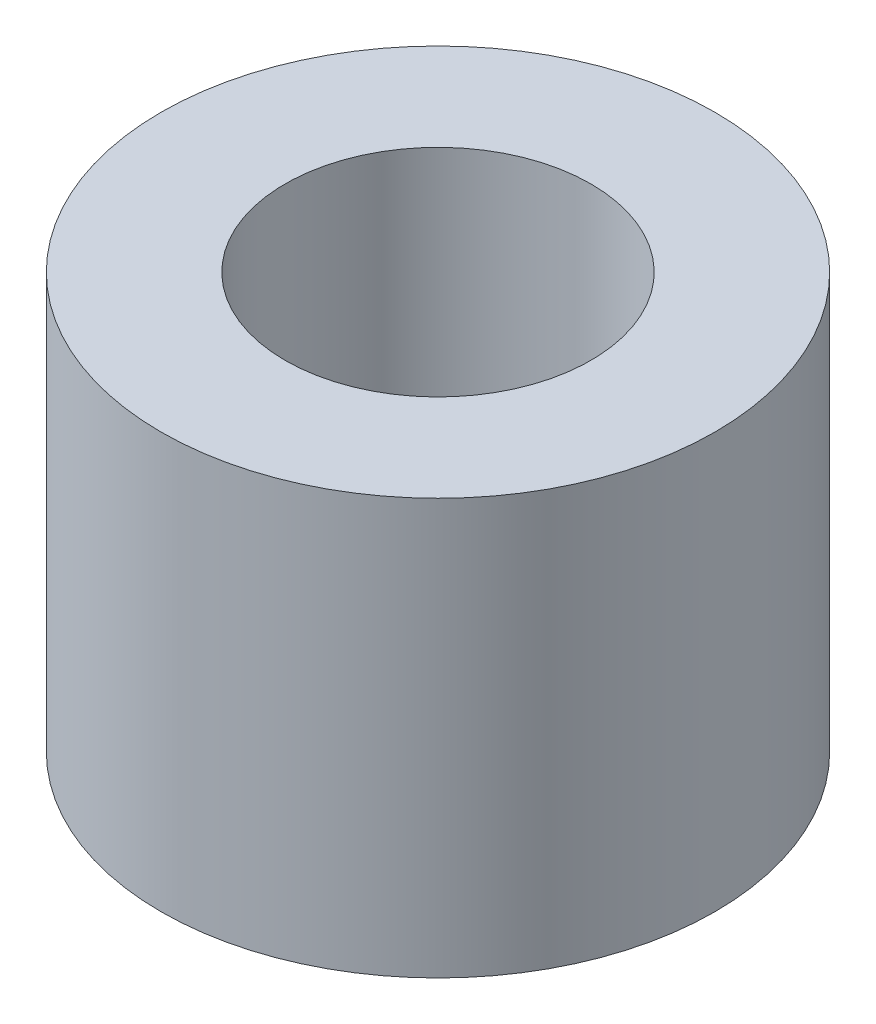
ISO-10303-21;
HEADER;
FILE_DESCRIPTION(('STEP AP214'),'2;1');
FILE_NAME('part.step','',(''),(''),'','','');
FILE_SCHEMA(('AUTOMOTIVE_DESIGN { 1 0 10303 214 1 1 1 1 }'));
ENDSEC;
DATA;
#1=APPLICATION_CONTEXT('core data for automotive mechanical design processes');
#2=APPLICATION_PROTOCOL_DEFINITION('international standard','automotive_design',2000,#1);
#3=PRODUCT_CONTEXT('',#1,'mechanical');
#4=PRODUCT('Part','Part','',(#3));
#5=PRODUCT_RELATED_PRODUCT_CATEGORY('part','',(#4));
#6=PRODUCT_DEFINITION_FORMATION('','',#4);
#7=PRODUCT_DEFINITION_CONTEXT('part definition',#1,'design');
#8=PRODUCT_DEFINITION('design','',#6,#7);
#9=PRODUCT_DEFINITION_SHAPE('','',#8);
#10=(LENGTH_UNIT() NAMED_UNIT(*) SI_UNIT(.MILLI.,.METRE.));
#11=(NAMED_UNIT(*) PLANE_ANGLE_UNIT() SI_UNIT($,.RADIAN.));
#12=(NAMED_UNIT(*) SI_UNIT($,.STERADIAN.) SOLID_ANGLE_UNIT());
#13=UNCERTAINTY_MEASURE_WITH_UNIT(LENGTH_MEASURE(1.E-05),#10,'distance_accuracy_value','');
#14=(GEOMETRIC_REPRESENTATION_CONTEXT(3) GLOBAL_UNCERTAINTY_ASSIGNED_CONTEXT((#13)) GLOBAL_UNIT_ASSIGNED_CONTEXT((#10,
#11,#12)) REPRESENTATION_CONTEXT('',''));
#15=CARTESIAN_POINT('',(0.,0.,0.));
#16=DIRECTION('',(0.,0.,1.));
#17=DIRECTION('',(1.,0.,0.));
#18=AXIS2_PLACEMENT_3D('',#15,#16,#17);
#19=CARTESIAN_POINT('',(0.,4.7625,0.));
#20=DIRECTION('',(0.,1.,0.));
#21=DIRECTION('',(0.,0.,1.));
#22=AXIS2_PLACEMENT_3D('',#19,#20,#21);
#23=PLANE('',#22);
#24=CARTESIAN_POINT('',(0.,4.7625,0.));
#25=DIRECTION('',(0.,1.,0.));
#26=DIRECTION('',(0.,0.,1.));
#27=AXIS2_PLACEMENT_3D('',#24,#25,#26);
#28=CIRCLE('',#27,3.175);
#29=CARTESIAN_POINT('',(0.,4.7625,-3.175));
#30=VERTEX_POINT('',#29);
#31=EDGE_CURVE('E10',#30,#30,#28,.T.);
#32=ORIENTED_EDGE('',*,*,#31,.T.);
#33=EDGE_LOOP('',(#32));
#34=FACE_BOUND('',#33,.T.);
#35=CARTESIAN_POINT('',(0.,4.7625,0.));
#36=DIRECTION('',(0.,1.,0.));
#37=DIRECTION('',(0.,0.,1.));
#38=AXIS2_PLACEMENT_3D('',#35,#36,#37);
#39=CIRCLE('',#38,1.7526);
#40=CARTESIAN_POINT('',(0.,4.7625,-1.7526));
#41=VERTEX_POINT('',#40);
#42=EDGE_CURVE('E39',#41,#41,#39,.T.);
#43=ORIENTED_EDGE('',*,*,#42,.F.);
#44=EDGE_LOOP('',(#43));
#45=FACE_BOUND('',#44,.T.);
#46=ADVANCED_FACE('F28',(#34,#45),#23,.T.);
#47=CARTESIAN_POINT('',(0.,0.,0.));
#48=DIRECTION('',(0.,1.,0.));
#49=DIRECTION('',(0.,0.,1.));
#50=AXIS2_PLACEMENT_3D('',#47,#48,#49);
#51=PLANE('',#50);
#52=CARTESIAN_POINT('',(0.,0.,0.));
#53=DIRECTION('',(0.,1.,0.));
#54=DIRECTION('',(0.,0.,1.));
#55=AXIS2_PLACEMENT_3D('',#52,#53,#54);
#56=CIRCLE('',#55,3.175);
#57=CARTESIAN_POINT('',(0.,0.,-3.175));
#58=VERTEX_POINT('',#57);
#59=EDGE_CURVE('E32',#58,#58,#56,.T.);
#60=ORIENTED_EDGE('',*,*,#59,.F.);
#61=EDGE_LOOP('',(#60));
#62=FACE_BOUND('',#61,.T.);
#63=CARTESIAN_POINT('',(0.,0.,0.));
#64=DIRECTION('',(0.,1.,0.));
#65=DIRECTION('',(0.,0.,1.));
#66=AXIS2_PLACEMENT_3D('',#63,#64,#65);
#67=CIRCLE('',#66,1.7526);
#68=CARTESIAN_POINT('',(0.,0.,-1.7526));
#69=VERTEX_POINT('',#68);
#70=EDGE_CURVE('E41',#69,#69,#67,.T.);
#71=ORIENTED_EDGE('',*,*,#70,.T.);
#72=EDGE_LOOP('',(#71));
#73=FACE_BOUND('',#72,.T.);
#74=ADVANCED_FACE('F51',(#62,#73),#51,.F.);
#75=CARTESIAN_POINT('',(0.,4.7625,0.));
#76=DIRECTION('',(0.,-1.,0.));
#77=DIRECTION('',(0.,0.,-1.));
#78=AXIS2_PLACEMENT_3D('',#75,#76,#77);
#79=CYLINDRICAL_SURFACE('',#78,3.175);
#80=CARTESIAN_POINT('',(0.,4.7625,-3.175));
#81=CARTESIAN_POINT('',(0.,4.712890625,-3.175));
#82=CARTESIAN_POINT('',(0.,4.66328125,-3.175));
#83=CARTESIAN_POINT('',(0.,4.5640625,-3.175));
#84=CARTESIAN_POINT('',(0.,4.514453125,-3.175));
#85=CARTESIAN_POINT('',(0.,4.415234375,-3.175));
#86=CARTESIAN_POINT('',(0.,4.365625,-3.175));
#87=CARTESIAN_POINT('',(0.,4.26640625,-3.175));
#88=CARTESIAN_POINT('',(0.,4.216796875,-3.175));
#89=CARTESIAN_POINT('',(0.,4.117578125,-3.175));
#90=CARTESIAN_POINT('',(0.,4.06796875,-3.175));
#91=CARTESIAN_POINT('',(0.,3.96875,-3.175));
#92=CARTESIAN_POINT('',(0.,3.919140625,-3.175));
#93=CARTESIAN_POINT('',(0.,3.819921875,-3.175));
#94=CARTESIAN_POINT('',(0.,3.7703125,-3.175));
#95=CARTESIAN_POINT('',(0.,3.67109375,-3.175));
#96=CARTESIAN_POINT('',(0.,3.621484375,-3.175));
#97=CARTESIAN_POINT('',(0.,3.522265625,-3.175));
#98=CARTESIAN_POINT('',(0.,3.47265625,-3.175));
#99=CARTESIAN_POINT('',(0.,3.3734375,-3.175));
#100=CARTESIAN_POINT('',(0.,3.323828125,-3.175));
#101=CARTESIAN_POINT('',(0.,3.224609375,-3.175));
#102=CARTESIAN_POINT('',(0.,3.175,-3.175));
#103=CARTESIAN_POINT('',(0.,3.07578125,-3.175));
#104=CARTESIAN_POINT('',(0.,3.026171875,-3.175));
#105=CARTESIAN_POINT('',(0.,2.926953125,-3.175));
#106=CARTESIAN_POINT('',(0.,2.87734375,-3.175));
#107=CARTESIAN_POINT('',(0.,2.778125,-3.175));
#108=CARTESIAN_POINT('',(0.,2.728515625,-3.175));
#109=CARTESIAN_POINT('',(0.,2.629296875,-3.175));
#110=CARTESIAN_POINT('',(0.,2.5796875,-3.175));
#111=CARTESIAN_POINT('',(0.,2.48046875,-3.175));
#112=CARTESIAN_POINT('',(0.,2.430859375,-3.175));
#113=CARTESIAN_POINT('',(0.,2.331640625,-3.175));
#114=CARTESIAN_POINT('',(0.,2.28203125,-3.175));
#115=CARTESIAN_POINT('',(0.,2.1828125,-3.175));
#116=CARTESIAN_POINT('',(0.,2.133203125,-3.175));
#117=CARTESIAN_POINT('',(0.,2.033984375,-3.175));
#118=CARTESIAN_POINT('',(0.,1.984375,-3.175));
#119=CARTESIAN_POINT('',(0.,1.88515625,-3.175));
#120=CARTESIAN_POINT('',(0.,1.835546875,-3.175));
#121=CARTESIAN_POINT('',(0.,1.736328125,-3.175));
#122=CARTESIAN_POINT('',(0.,1.68671875,-3.175));
#123=CARTESIAN_POINT('',(0.,1.5875,-3.175));
#124=CARTESIAN_POINT('',(0.,1.537890625,-3.175));
#125=CARTESIAN_POINT('',(0.,1.438671875,-3.175));
#126=CARTESIAN_POINT('',(0.,1.3890625,-3.175));
#127=CARTESIAN_POINT('',(0.,1.28984375,-3.175));
#128=CARTESIAN_POINT('',(0.,1.240234375,-3.175));
#129=CARTESIAN_POINT('',(0.,1.141015625,-3.175));
#130=CARTESIAN_POINT('',(0.,1.09140625,-3.175));
#131=CARTESIAN_POINT('',(0.,0.9921875,-3.175));
#132=CARTESIAN_POINT('',(0.,0.942578125,-3.175));
#133=CARTESIAN_POINT('',(0.,0.843359375,-3.175));
#134=CARTESIAN_POINT('',(0.,0.79375,-3.175));
#135=CARTESIAN_POINT('',(0.,0.69453125,-3.175));
#136=CARTESIAN_POINT('',(0.,0.644921875,-3.175));
#137=CARTESIAN_POINT('',(0.,0.545703125,-3.175));
#138=CARTESIAN_POINT('',(0.,0.49609375,-3.175));
#139=CARTESIAN_POINT('',(0.,0.396875,-3.175));
#140=CARTESIAN_POINT('',(0.,0.347265625,-3.175));
#141=CARTESIAN_POINT('',(0.,0.248046875,-3.175));
#142=CARTESIAN_POINT('',(0.,0.1984375,-3.175));
#143=CARTESIAN_POINT('',(0.,0.09921875,-3.175));
#144=CARTESIAN_POINT('',(0.,0.049609375,-3.175));
#145=CARTESIAN_POINT('',(0.,0.,-3.175));
#146=B_SPLINE_CURVE_WITH_KNOTS('',3,(#80,#81,#82,#83,#84,#85,#86,#87,#88,#89,#90,#91,#92,#93,
#94,#95,#96,#97,#98,#99,#100,#101,#102,#103,#104,#105,#106,#107,#108,#109,#110,#111,#112,#113,
#114,#115,#116,#117,#118,#119,#120,#121,#122,#123,#124,#125,#126,#127,#128,#129,#130,#131,#132,
#133,#134,#135,#136,#137,#138,#139,#140,#141,#142,#143,#144,#145),.UNSPECIFIED.,.F.,.F.,(4,2,2,
2,2,2,2,2,2,2,2,2,2,2,2,2,2,2,2,2,2,2,2,2,2,2,2,2,2,2,2,2,4),(0.,0.148828124999999,
0.297656249999999,0.446484374999999,0.595312499999999,0.744140625,0.89296875,1.041796875,
1.190625,1.339453125,1.48828125,1.637109375,1.7859375,1.934765625,2.08359375,2.232421875,
2.38125,2.530078125,2.67890625,2.827734375,2.9765625,3.125390625,3.27421875,3.423046875,
3.571875,3.720703125,3.86953125,4.018359375,4.1671875,4.316015625,4.46484375,4.613671875,
4.7625),.UNSPECIFIED.);
#147=EDGE_CURVE('BSEAM30',#30,#58,#146,.T.);
#148=ORIENTED_EDGE('',*,*,#31,.F.);
#149=ORIENTED_EDGE('',*,*,#59,.T.);
#150=ORIENTED_EDGE('',*,*,#147,.T.);
#151=ORIENTED_EDGE('',*,*,#147,.F.);
#152=EDGE_LOOP('',(#148,#150,#149,#151));
#153=FACE_BOUND('',#152,.T.);
#154=ADVANCED_FACE('F30',(#153),#79,.T.);
#155=CARTESIAN_POINT('',(0.,4.7625,0.));
#156=DIRECTION('',(0.,-1.,0.));
#157=DIRECTION('',(0.,0.,-1.));
#158=AXIS2_PLACEMENT_3D('',#155,#156,#157);
#159=CYLINDRICAL_SURFACE('',#158,1.7526);
#160=CARTESIAN_POINT('',(0.,4.7625,-1.7526));
#161=CARTESIAN_POINT('',(0.,4.712890625,-1.7526));
#162=CARTESIAN_POINT('',(0.,4.66328125,-1.7526));
#163=CARTESIAN_POINT('',(0.,4.5640625,-1.7526));
#164=CARTESIAN_POINT('',(0.,4.514453125,-1.7526));
#165=CARTESIAN_POINT('',(0.,4.415234375,-1.7526));
#166=CARTESIAN_POINT('',(0.,4.365625,-1.7526));
#167=CARTESIAN_POINT('',(0.,4.26640625,-1.7526));
#168=CARTESIAN_POINT('',(0.,4.216796875,-1.7526));
#169=CARTESIAN_POINT('',(0.,4.117578125,-1.7526));
#170=CARTESIAN_POINT('',(0.,4.06796875,-1.7526));
#171=CARTESIAN_POINT('',(0.,3.96875,-1.7526));
#172=CARTESIAN_POINT('',(0.,3.919140625,-1.7526));
#173=CARTESIAN_POINT('',(0.,3.819921875,-1.7526));
#174=CARTESIAN_POINT('',(0.,3.7703125,-1.7526));
#175=CARTESIAN_POINT('',(0.,3.67109375,-1.7526));
#176=CARTESIAN_POINT('',(0.,3.621484375,-1.7526));
#177=CARTESIAN_POINT('',(0.,3.522265625,-1.7526));
#178=CARTESIAN_POINT('',(0.,3.47265625,-1.7526));
#179=CARTESIAN_POINT('',(0.,3.3734375,-1.7526));
#180=CARTESIAN_POINT('',(0.,3.323828125,-1.7526));
#181=CARTESIAN_POINT('',(0.,3.224609375,-1.7526));
#182=CARTESIAN_POINT('',(0.,3.175,-1.7526));
#183=CARTESIAN_POINT('',(0.,3.07578125,-1.7526));
#184=CARTESIAN_POINT('',(0.,3.026171875,-1.7526));
#185=CARTESIAN_POINT('',(0.,2.926953125,-1.7526));
#186=CARTESIAN_POINT('',(0.,2.87734375,-1.7526));
#187=CARTESIAN_POINT('',(0.,2.778125,-1.7526));
#188=CARTESIAN_POINT('',(0.,2.728515625,-1.7526));
#189=CARTESIAN_POINT('',(0.,2.629296875,-1.7526));
#190=CARTESIAN_POINT('',(0.,2.5796875,-1.7526));
#191=CARTESIAN_POINT('',(0.,2.48046875,-1.7526));
#192=CARTESIAN_POINT('',(0.,2.430859375,-1.7526));
#193=CARTESIAN_POINT('',(0.,2.331640625,-1.7526));
#194=CARTESIAN_POINT('',(0.,2.28203125,-1.7526));
#195=CARTESIAN_POINT('',(0.,2.1828125,-1.7526));
#196=CARTESIAN_POINT('',(0.,2.133203125,-1.7526));
#197=CARTESIAN_POINT('',(0.,2.033984375,-1.7526));
#198=CARTESIAN_POINT('',(0.,1.984375,-1.7526));
#199=CARTESIAN_POINT('',(0.,1.88515625,-1.7526));
#200=CARTESIAN_POINT('',(0.,1.835546875,-1.7526));
#201=CARTESIAN_POINT('',(0.,1.736328125,-1.7526));
#202=CARTESIAN_POINT('',(0.,1.68671875,-1.7526));
#203=CARTESIAN_POINT('',(0.,1.5875,-1.7526));
#204=CARTESIAN_POINT('',(0.,1.537890625,-1.7526));
#205=CARTESIAN_POINT('',(0.,1.438671875,-1.7526));
#206=CARTESIAN_POINT('',(0.,1.3890625,-1.7526));
#207=CARTESIAN_POINT('',(0.,1.28984375,-1.7526));
#208=CARTESIAN_POINT('',(0.,1.240234375,-1.7526));
#209=CARTESIAN_POINT('',(0.,1.141015625,-1.7526));
#210=CARTESIAN_POINT('',(0.,1.09140625,-1.7526));
#211=CARTESIAN_POINT('',(0.,0.9921875,-1.7526));
#212=CARTESIAN_POINT('',(0.,0.942578125,-1.7526));
#213=CARTESIAN_POINT('',(0.,0.843359375,-1.7526));
#214=CARTESIAN_POINT('',(0.,0.79375,-1.7526));
#215=CARTESIAN_POINT('',(0.,0.69453125,-1.7526));
#216=CARTESIAN_POINT('',(0.,0.644921875,-1.7526));
#217=CARTESIAN_POINT('',(0.,0.545703125,-1.7526));
#218=CARTESIAN_POINT('',(0.,0.49609375,-1.7526));
#219=CARTESIAN_POINT('',(0.,0.396875,-1.7526));
#220=CARTESIAN_POINT('',(0.,0.347265625,-1.7526));
#221=CARTESIAN_POINT('',(0.,0.248046875,-1.7526));
#222=CARTESIAN_POINT('',(0.,0.1984375,-1.7526));
#223=CARTESIAN_POINT('',(0.,0.09921875,-1.7526));
#224=CARTESIAN_POINT('',(0.,0.049609375,-1.7526));
#225=CARTESIAN_POINT('',(0.,0.,-1.7526));
#226=B_SPLINE_CURVE_WITH_KNOTS('',3,(#160,#161,#162,#163,#164,#165,#166,#167,#168,#169,#170,
#171,#172,#173,#174,#175,#176,#177,#178,#179,#180,#181,#182,#183,#184,#185,#186,#187,#188,#189,
#190,#191,#192,#193,#194,#195,#196,#197,#198,#199,#200,#201,#202,#203,#204,#205,#206,#207,#208,
#209,#210,#211,#212,#213,#214,#215,#216,#217,#218,#219,#220,#221,#222,#223,#224,#225),
.UNSPECIFIED.,.F.,.F.,(4,2,2,2,2,2,2,2,2,2,2,2,2,2,2,2,2,2,2,2,2,2,2,2,2,2,2,2,2,2,2,2,4),(0.,
0.148828124999999,0.297656249999999,0.446484374999999,0.595312499999999,0.744140625,0.89296875,
1.041796875,1.190625,1.339453125,1.48828125,1.637109375,1.7859375,1.934765625,2.08359375,
2.232421875,2.38125,2.530078125,2.67890625,2.827734375,2.9765625,3.125390625,3.27421875,
3.423046875,3.571875,3.720703125,3.86953125,4.018359375,4.1671875,4.316015625,4.46484375,
4.613671875,4.7625),.UNSPECIFIED.);
#227=EDGE_CURVE('BSEAM47',#41,#69,#226,.T.);
#228=ORIENTED_EDGE('',*,*,#42,.T.);
#229=ORIENTED_EDGE('',*,*,#70,.F.);
#230=ORIENTED_EDGE('',*,*,#227,.T.);
#231=ORIENTED_EDGE('',*,*,#227,.F.);
#232=EDGE_LOOP('',(#228,#230,#229,#231));
#233=FACE_BOUND('',#232,.T.);
#234=ADVANCED_FACE('F47',(#233),#159,.F.);
#235=CLOSED_SHELL('',(#46,#74,#154,#234));
#236=MANIFOLD_SOLID_BREP('B2',#235);
#237=ADVANCED_BREP_SHAPE_REPRESENTATION('',(#18,#236),#14);
#238=SHAPE_DEFINITION_REPRESENTATION(#9,#237);
ENDSEC;
END-ISO-10303-21;
